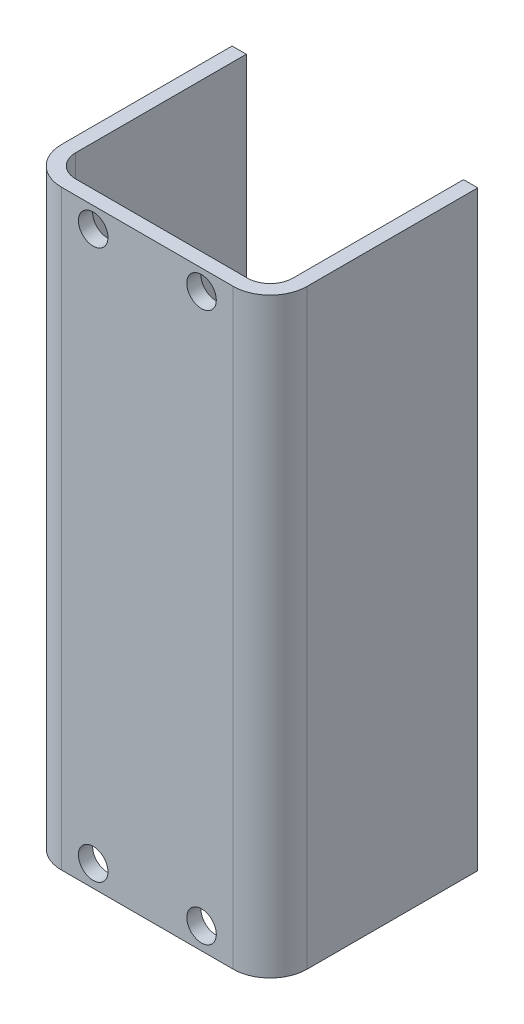
ISO-10303-21;
HEADER;
FILE_DESCRIPTION(('STEP AP214'),'2;1');
FILE_NAME('part.step','',(''),(''),'','','');
FILE_SCHEMA(('AUTOMOTIVE_DESIGN { 1 0 10303 214 1 1 1 1 }'));
ENDSEC;
DATA;
#1=APPLICATION_CONTEXT('core data for automotive mechanical design processes');
#2=APPLICATION_PROTOCOL_DEFINITION('international standard','automotive_design',2000,#1);
#3=PRODUCT_CONTEXT('',#1,'mechanical');
#4=PRODUCT('Part','Part','',(#3));
#5=PRODUCT_RELATED_PRODUCT_CATEGORY('part','',(#4));
#6=PRODUCT_DEFINITION_FORMATION('','',#4);
#7=PRODUCT_DEFINITION_CONTEXT('part definition',#1,'design');
#8=PRODUCT_DEFINITION('design','',#6,#7);
#9=PRODUCT_DEFINITION_SHAPE('','',#8);
#10=(LENGTH_UNIT() NAMED_UNIT(*) SI_UNIT(.MILLI.,.METRE.));
#11=(NAMED_UNIT(*) PLANE_ANGLE_UNIT() SI_UNIT($,.RADIAN.));
#12=(NAMED_UNIT(*) SI_UNIT($,.STERADIAN.) SOLID_ANGLE_UNIT());
#13=UNCERTAINTY_MEASURE_WITH_UNIT(LENGTH_MEASURE(1.E-05),#10,'distance_accuracy_value','');
#14=(GEOMETRIC_REPRESENTATION_CONTEXT(3) GLOBAL_UNCERTAINTY_ASSIGNED_CONTEXT((#13)) GLOBAL_UNIT_ASSIGNED_CONTEXT((#10,
#11,#12)) REPRESENTATION_CONTEXT('',''));
#15=CARTESIAN_POINT('',(0.,0.,0.));
#16=DIRECTION('',(0.,0.,1.));
#17=DIRECTION('',(1.,0.,0.));
#18=AXIS2_PLACEMENT_3D('',#15,#16,#17);
#19=CARTESIAN_POINT('',(4.,104.,-4.));
#20=DIRECTION('',(0.,-1.,0.));
#21=DIRECTION('',(0.,0.,-1.));
#22=AXIS2_PLACEMENT_3D('',#19,#20,#21);
#23=CYLINDRICAL_SURFACE('',#22,4.);
#24=DIRECTION('',(0.,-1.,0.));
#25=VECTOR('',#24,1.);
#26=CARTESIAN_POINT('',(0.,104.,-4.00000000000003));
#27=LINE('',#26,#25);
#28=CARTESIAN_POINT('',(0.,49.5953124657902,-4.00000000000003));
#29=VERTEX_POINT('',#28);
#30=CARTESIAN_POINT('',(0.,0.,-4.00000000000003));
#31=VERTEX_POINT('',#30);
#32=EDGE_CURVE('E331',#29,#31,#27,.T.);
#33=ORIENTED_EDGE('',*,*,#32,.F.);
#34=CARTESIAN_POINT('',(4.,49.5953124657902,-4.));
#35=DIRECTION('',(0.,1.,0.));
#36=DIRECTION('',(0.,0.,1.));
#37=AXIS2_PLACEMENT_3D('',#34,#35,#36);
#38=CIRCLE('',#37,4.);
#39=CARTESIAN_POINT('',(4.00000000000003,49.5953124657902,0.));
#40=VERTEX_POINT('',#39);
#41=EDGE_CURVE('E345',#29,#40,#38,.T.);
#42=ORIENTED_EDGE('',*,*,#41,.T.);
#43=DIRECTION('',(0.,-1.,0.));
#44=VECTOR('',#43,1.);
#45=CARTESIAN_POINT('',(4.00000000000003,104.,0.));
#46=LINE('',#45,#44);
#47=CARTESIAN_POINT('',(4.00000000000003,0.,0.));
#48=VERTEX_POINT('',#47);
#49=EDGE_CURVE('E335',#40,#48,#46,.T.);
#50=ORIENTED_EDGE('',*,*,#49,.T.);
#51=CARTESIAN_POINT('',(4.,0.,-4.));
#52=DIRECTION('',(0.,-1.,0.));
#53=DIRECTION('',(0.,0.,-1.));
#54=AXIS2_PLACEMENT_3D('',#51,#52,#53);
#55=CIRCLE('',#54,4.);
#56=EDGE_CURVE('E283',#48,#31,#55,.T.);
#57=ORIENTED_EDGE('',*,*,#56,.T.);
#58=EDGE_LOOP('',(#33,#42,#50,#57));
#59=FACE_BOUND('',#58,.T.);
#60=ADVANCED_FACE('F41',(#59),#23,.F.);
#61=CARTESIAN_POINT('',(34.2,104.,-4.));
#62=DIRECTION('',(0.,-1.,0.));
#63=DIRECTION('',(0.,0.,-1.));
#64=AXIS2_PLACEMENT_3D('',#61,#62,#63);
#65=CYLINDRICAL_SURFACE('',#64,4.);
#66=DIRECTION('',(0.,-1.,0.));
#67=VECTOR('',#66,1.);
#68=CARTESIAN_POINT('',(38.2,104.,-4.00000000000003));
#69=LINE('',#68,#67);
#70=CARTESIAN_POINT('',(38.2,104.,-4.00000000000003));
#71=VERTEX_POINT('',#70);
#72=CARTESIAN_POINT('',(38.2,55.5953124657902,-4.00000000000003));
#73=VERTEX_POINT('',#72);
#74=EDGE_CURVE('E304',#71,#73,#69,.T.);
#75=ORIENTED_EDGE('',*,*,#74,.T.);
#76=CARTESIAN_POINT('',(34.2,55.5953124657902,-4.));
#77=DIRECTION('',(0.,-1.,0.));
#78=DIRECTION('',(0.,0.,-1.));
#79=AXIS2_PLACEMENT_3D('',#76,#77,#78);
#80=CIRCLE('',#79,4.);
#81=CARTESIAN_POINT('',(34.2,55.5953124657902,0.));
#82=VERTEX_POINT('',#81);
#83=EDGE_CURVE('E342',#73,#82,#80,.T.);
#84=ORIENTED_EDGE('',*,*,#83,.T.);
#85=DIRECTION('',(0.,-1.,0.));
#86=VECTOR('',#85,1.);
#87=CARTESIAN_POINT('',(34.2,104.,0.));
#88=LINE('',#87,#86);
#89=CARTESIAN_POINT('',(34.2,104.,0.));
#90=VERTEX_POINT('',#89);
#91=EDGE_CURVE('E339',#90,#82,#88,.T.);
#92=ORIENTED_EDGE('',*,*,#91,.F.);
#93=CARTESIAN_POINT('',(34.2,104.,-4.));
#94=DIRECTION('',(0.,-1.,0.));
#95=DIRECTION('',(0.,0.,1.));
#96=AXIS2_PLACEMENT_3D('',#93,#94,#95);
#97=CIRCLE('',#96,4.);
#98=EDGE_CURVE('E251',#71,#90,#97,.T.);
#99=ORIENTED_EDGE('',*,*,#98,.F.);
#100=EDGE_LOOP('',(#75,#84,#92,#99));
#101=FACE_BOUND('',#100,.T.);
#102=ADVANCED_FACE('F407',(#101),#65,.F.);
#103=CARTESIAN_POINT('',(4.00000000000003,104.,0.));
#104=DIRECTION('',(0.,0.,1.));
#105=DIRECTION('',(1.,0.,0.));
#106=AXIS2_PLACEMENT_3D('',#103,#104,#105);
#107=PLANE('',#106);
#108=CARTESIAN_POINT('',(9.575,3.81000000000002,0.));
#109=DIRECTION('',(0.,0.,1.));
#110=DIRECTION('',(1.,0.,0.));
#111=AXIS2_PLACEMENT_3D('',#108,#109,#110);
#112=CIRCLE('',#111,2.60000000000001);
#113=CARTESIAN_POINT('',(12.175,3.81000000000002,0.));
#114=VERTEX_POINT('',#113);
#115=EDGE_CURVE('E238',#114,#114,#112,.T.);
#116=ORIENTED_EDGE('',*,*,#115,.T.);
#117=EDGE_LOOP('',(#116));
#118=FACE_BOUND('',#117,.T.);
#119=CARTESIAN_POINT('',(28.625,3.81000000000009,0.));
#120=DIRECTION('',(0.,0.,1.));
#121=DIRECTION('',(1.,0.,0.));
#122=AXIS2_PLACEMENT_3D('',#119,#120,#121);
#123=CIRCLE('',#122,2.59999999999999);
#124=CARTESIAN_POINT('',(31.225,3.81000000000009,0.));
#125=VERTEX_POINT('',#124);
#126=EDGE_CURVE('E247',#125,#125,#123,.T.);
#127=ORIENTED_EDGE('',*,*,#126,.T.);
#128=EDGE_LOOP('',(#127));
#129=FACE_BOUND('',#128,.T.);
#130=DIRECTION('',(-1.,0.,0.));
#131=VECTOR('',#130,1.);
#132=CARTESIAN_POINT('',(34.2,49.5953124657902,0.));
#133=LINE('',#132,#131);
#134=CARTESIAN_POINT('',(34.2,49.5953124657902,0.));
#135=VERTEX_POINT('',#134);
#136=EDGE_CURVE('E220',#135,#40,#133,.T.);
#137=ORIENTED_EDGE('',*,*,#136,.F.);
#138=CARTESIAN_POINT('',(34.2,0.,0.));
#139=VERTEX_POINT('',#138);
#140=EDGE_CURVE('E338',#135,#139,#88,.T.);
#141=ORIENTED_EDGE('',*,*,#140,.T.);
#142=DIRECTION('',(-1.,0.,0.));
#143=VECTOR('',#142,1.);
#144=CARTESIAN_POINT('',(4.00000000000003,0.,0.));
#145=LINE('',#144,#143);
#146=EDGE_CURVE('E280',#139,#48,#145,.T.);
#147=ORIENTED_EDGE('',*,*,#146,.T.);
#148=ORIENTED_EDGE('',*,*,#49,.F.);
#149=EDGE_LOOP('',(#137,#141,#147,#148));
#150=FACE_BOUND('',#149,.T.);
#151=ADVANCED_FACE('F409',(#118,#129,#150),#107,.F.);
#152=CARTESIAN_POINT('',(28.6249999999997,100.41,0.));
#153=DIRECTION('',(0.,0.,1.));
#154=DIRECTION('',(1.,0.,0.));
#155=AXIS2_PLACEMENT_3D('',#152,#153,#154);
#156=CIRCLE('',#155,2.6);
#157=CARTESIAN_POINT('',(31.2249999999997,100.41,0.));
#158=VERTEX_POINT('',#157);
#159=EDGE_CURVE('E241',#158,#158,#156,.T.);
#160=ORIENTED_EDGE('',*,*,#159,.T.);
#161=EDGE_LOOP('',(#160));
#162=FACE_BOUND('',#161,.T.);
#163=CARTESIAN_POINT('',(9.57499999999966,100.41,0.));
#164=DIRECTION('',(0.,0.,1.));
#165=DIRECTION('',(1.,0.,0.));
#166=AXIS2_PLACEMENT_3D('',#163,#164,#165);
#167=CIRCLE('',#166,2.6);
#168=CARTESIAN_POINT('',(12.1749999999997,100.41,0.));
#169=VERTEX_POINT('',#168);
#170=EDGE_CURVE('E244',#169,#169,#167,.T.);
#171=ORIENTED_EDGE('',*,*,#170,.T.);
#172=EDGE_LOOP('',(#171));
#173=FACE_BOUND('',#172,.T.);
#174=DIRECTION('',(1.,0.,0.));
#175=VECTOR('',#174,1.);
#176=CARTESIAN_POINT('',(34.2,55.5953124657902,0.));
#177=LINE('',#176,#175);
#178=CARTESIAN_POINT('',(4.00000000000003,55.5953124657902,0.));
#179=VERTEX_POINT('',#178);
#180=EDGE_CURVE('E217',#179,#82,#177,.T.);
#181=ORIENTED_EDGE('',*,*,#180,.F.);
#182=CARTESIAN_POINT('',(4.00000000000003,104.,0.));
#183=VERTEX_POINT('',#182);
#184=EDGE_CURVE('E336',#183,#179,#46,.T.);
#185=ORIENTED_EDGE('',*,*,#184,.F.);
#186=DIRECTION('',(-1.,0.,0.));
#187=VECTOR('',#186,1.);
#188=CARTESIAN_POINT('',(4.00000000000003,104.,0.));
#189=LINE('',#188,#187);
#190=EDGE_CURVE('E254',#90,#183,#189,.T.);
#191=ORIENTED_EDGE('',*,*,#190,.F.);
#192=ORIENTED_EDGE('',*,*,#91,.T.);
#193=EDGE_LOOP('',(#181,#185,#191,#192));
#194=FACE_BOUND('',#193,.T.);
#195=ADVANCED_FACE('F399',(#162,#173,#194),#107,.F.);
#196=CARTESIAN_POINT('',(34.2,49.5953124657902,-4.));
#197=DIRECTION('',(0.,1.,0.));
#198=DIRECTION('',(0.,0.,1.));
#199=AXIS2_PLACEMENT_3D('',#196,#197,#198);
#200=CIRCLE('',#199,4.);
#201=CARTESIAN_POINT('',(38.2,49.5953124657902,-4.00000000000003));
#202=VERTEX_POINT('',#201);
#203=EDGE_CURVE('E64',#135,#202,#200,.T.);
#204=ORIENTED_EDGE('',*,*,#203,.T.);
#205=CARTESIAN_POINT('',(38.2,0.,-4.00000000000003));
#206=VERTEX_POINT('',#205);
#207=EDGE_CURVE('E277',#202,#206,#69,.T.);
#208=ORIENTED_EDGE('',*,*,#207,.T.);
#209=CARTESIAN_POINT('',(34.2,0.,-4.));
#210=DIRECTION('',(0.,-1.,0.));
#211=DIRECTION('',(0.,0.,1.));
#212=AXIS2_PLACEMENT_3D('',#209,#210,#211);
#213=CIRCLE('',#212,4.);
#214=EDGE_CURVE('E250',#206,#139,#213,.T.);
#215=ORIENTED_EDGE('',*,*,#214,.T.);
#216=ORIENTED_EDGE('',*,*,#140,.F.);
#217=EDGE_LOOP('',(#204,#208,#215,#216));
#218=FACE_BOUND('',#217,.T.);
#219=ADVANCED_FACE('F411',(#218),#65,.F.);
#220=CARTESIAN_POINT('',(4.,55.5953124657902,-4.));
#221=DIRECTION('',(0.,-1.,0.));
#222=DIRECTION('',(0.,0.,-1.));
#223=AXIS2_PLACEMENT_3D('',#220,#221,#222);
#224=CIRCLE('',#223,4.);
#225=CARTESIAN_POINT('',(0.,55.5953124657902,-4.00000000000003));
#226=VERTEX_POINT('',#225);
#227=EDGE_CURVE('E56',#179,#226,#224,.T.);
#228=ORIENTED_EDGE('',*,*,#227,.T.);
#229=CARTESIAN_POINT('',(0.,104.,-4.00000000000003));
#230=VERTEX_POINT('',#229);
#231=EDGE_CURVE('E332',#230,#226,#27,.T.);
#232=ORIENTED_EDGE('',*,*,#231,.F.);
#233=CARTESIAN_POINT('',(4.,104.,-4.));
#234=DIRECTION('',(0.,-1.,0.));
#235=DIRECTION('',(0.,0.,-1.));
#236=AXIS2_PLACEMENT_3D('',#233,#234,#235);
#237=CIRCLE('',#236,4.);
#238=EDGE_CURVE('E257',#183,#230,#237,.T.);
#239=ORIENTED_EDGE('',*,*,#238,.F.);
#240=ORIENTED_EDGE('',*,*,#184,.T.);
#241=EDGE_LOOP('',(#228,#232,#239,#240));
#242=FACE_BOUND('',#241,.T.);
#243=ADVANCED_FACE('F391',(#242),#23,.F.);
#244=CARTESIAN_POINT('',(0.,104.,-4.00000000000003));
#245=DIRECTION('',(-1.,0.,0.));
#246=DIRECTION('',(0.,0.,1.));
#247=AXIS2_PLACEMENT_3D('',#244,#245,#246);
#248=PLANE('',#247);
#249=DIRECTION('',(0.,1.,0.));
#250=VECTOR('',#249,1.);
#251=CARTESIAN_POINT('',(0.,104.,-4.85941170815556));
#252=LINE('',#251,#250);
#253=CARTESIAN_POINT('',(0.,55.5953124657902,-4.85941170815556));
#254=VERTEX_POINT('',#253);
#255=CARTESIAN_POINT('',(0.,49.5953124657902,-4.85941170815556));
#256=VERTEX_POINT('',#255);
#257=EDGE_CURVE('E366',#254,#256,#252,.F.);
#258=ORIENTED_EDGE('',*,*,#257,.T.);
#259=DIRECTION('',(0.,0.,1.));
#260=VECTOR('',#259,1.);
#261=CARTESIAN_POINT('',(0.,49.5953124657902,-2.));
#262=LINE('',#261,#260);
#263=EDGE_CURVE('E369',#256,#29,#262,.T.);
#264=ORIENTED_EDGE('',*,*,#263,.T.);
#265=ORIENTED_EDGE('',*,*,#32,.T.);
#266=DIRECTION('',(0.,0.,-1.));
#267=VECTOR('',#266,1.);
#268=CARTESIAN_POINT('',(0.,0.,-4.00000000000003));
#269=LINE('',#268,#267);
#270=CARTESIAN_POINT('',(0.,0.,-34.));
#271=VERTEX_POINT('',#270);
#272=EDGE_CURVE('E286',#31,#271,#269,.T.);
#273=ORIENTED_EDGE('',*,*,#272,.T.);
#274=DIRECTION('',(0.,-1.,0.));
#275=VECTOR('',#274,1.);
#276=CARTESIAN_POINT('',(0.,104.,-34.));
#277=LINE('',#276,#275);
#278=CARTESIAN_POINT('',(0.,104.,-34.));
#279=VERTEX_POINT('',#278);
#280=EDGE_CURVE('E328',#279,#271,#277,.T.);
#281=ORIENTED_EDGE('',*,*,#280,.F.);
#282=DIRECTION('',(0.,0.,-1.));
#283=VECTOR('',#282,1.);
#284=CARTESIAN_POINT('',(0.,104.,-4.00000000000003));
#285=LINE('',#284,#283);
#286=EDGE_CURVE('E259',#230,#279,#285,.T.);
#287=ORIENTED_EDGE('',*,*,#286,.F.);
#288=ORIENTED_EDGE('',*,*,#231,.T.);
#289=DIRECTION('',(0.,0.,-1.));
#290=VECTOR('',#289,1.);
#291=CARTESIAN_POINT('',(0.,55.5953124657902,-2.));
#292=LINE('',#291,#290);
#293=EDGE_CURVE('E363',#226,#254,#292,.T.);
#294=ORIENTED_EDGE('',*,*,#293,.T.);
#295=EDGE_LOOP('',(#258,#264,#265,#273,#281,#287,#288,#294));
#296=FACE_BOUND('',#295,.T.);
#297=ADVANCED_FACE('F387',(#296),#248,.F.);
#298=CARTESIAN_POINT('',(-2.5,104.,-34.));
#299=DIRECTION('',(0.,0.,1.));
#300=DIRECTION('',(1.,0.,0.));
#301=AXIS2_PLACEMENT_3D('',#298,#299,#300);
#302=PLANE('',#301);
#303=DIRECTION('',(-1.,0.,0.));
#304=VECTOR('',#303,1.);
#305=CARTESIAN_POINT('',(-2.5,0.,-34.));
#306=LINE('',#305,#304);
#307=CARTESIAN_POINT('',(-2.5,0.,-34.));
#308=VERTEX_POINT('',#307);
#309=EDGE_CURVE('E288',#271,#308,#306,.T.);
#310=ORIENTED_EDGE('',*,*,#309,.T.);
#311=DIRECTION('',(0.,-1.,0.));
#312=VECTOR('',#311,1.);
#313=CARTESIAN_POINT('',(-2.5,104.,-34.));
#314=LINE('',#313,#312);
#315=CARTESIAN_POINT('',(-2.5,104.,-34.));
#316=VERTEX_POINT('',#315);
#317=EDGE_CURVE('E325',#316,#308,#314,.T.);
#318=ORIENTED_EDGE('',*,*,#317,.F.);
#319=DIRECTION('',(-1.,0.,0.));
#320=VECTOR('',#319,1.);
#321=CARTESIAN_POINT('',(-2.5,104.,-34.));
#322=LINE('',#321,#320);
#323=EDGE_CURVE('E261',#279,#316,#322,.T.);
#324=ORIENTED_EDGE('',*,*,#323,.F.);
#325=ORIENTED_EDGE('',*,*,#280,.T.);
#326=EDGE_LOOP('',(#310,#318,#324,#325));
#327=FACE_BOUND('',#326,.T.);
#328=ADVANCED_FACE('F434',(#327),#302,.F.);
#329=CARTESIAN_POINT('',(-2.5,104.,-4.00000000000003));
#330=DIRECTION('',(1.,0.,0.));
#331=DIRECTION('',(0.,0.,-1.));
#332=AXIS2_PLACEMENT_3D('',#329,#330,#331);
#333=PLANE('',#332);
#334=DIRECTION('',(0.,0.,1.));
#335=VECTOR('',#334,1.);
#336=CARTESIAN_POINT('',(-2.5,0.,-4.00000000000003));
#337=LINE('',#336,#335);
#338=CARTESIAN_POINT('',(-2.5,0.,-4.00000000000003));
#339=VERTEX_POINT('',#338);
#340=EDGE_CURVE('E290',#308,#339,#337,.T.);
#341=ORIENTED_EDGE('',*,*,#340,.T.);
#342=DIRECTION('',(0.,-1.,0.));
#343=VECTOR('',#342,1.);
#344=CARTESIAN_POINT('',(-2.5,104.,-4.00000000000003));
#345=LINE('',#344,#343);
#346=CARTESIAN_POINT('',(-2.5,104.,-4.00000000000003));
#347=VERTEX_POINT('',#346);
#348=EDGE_CURVE('E322',#347,#339,#345,.T.);
#349=ORIENTED_EDGE('',*,*,#348,.F.);
#350=DIRECTION('',(0.,0.,1.));
#351=VECTOR('',#350,1.);
#352=CARTESIAN_POINT('',(-2.5,104.,-4.00000000000003));
#353=LINE('',#352,#351);
#354=EDGE_CURVE('E263',#316,#347,#353,.T.);
#355=ORIENTED_EDGE('',*,*,#354,.F.);
#356=ORIENTED_EDGE('',*,*,#317,.T.);
#357=EDGE_LOOP('',(#341,#349,#355,#356));
#358=FACE_BOUND('',#357,.T.);
#359=ADVANCED_FACE('F437',(#358),#333,.F.);
#360=CARTESIAN_POINT('',(4.,104.,-4.));
#361=DIRECTION('',(0.,-1.,0.));
#362=DIRECTION('',(0.,0.,-1.));
#363=AXIS2_PLACEMENT_3D('',#360,#361,#362);
#364=CYLINDRICAL_SURFACE('',#363,6.5);
#365=CARTESIAN_POINT('',(4.,0.,-4.));
#366=DIRECTION('',(0.,1.,0.));
#367=DIRECTION('',(0.,0.,-1.));
#368=AXIS2_PLACEMENT_3D('',#365,#366,#367);
#369=CIRCLE('',#368,6.5);
#370=CARTESIAN_POINT('',(4.00000000000004,0.,2.5));
#371=VERTEX_POINT('',#370);
#372=EDGE_CURVE('E292',#339,#371,#369,.T.);
#373=ORIENTED_EDGE('',*,*,#372,.T.);
#374=DIRECTION('',(0.,-1.,0.));
#375=VECTOR('',#374,1.);
#376=CARTESIAN_POINT('',(4.00000000000004,104.,2.5));
#377=LINE('',#376,#375);
#378=CARTESIAN_POINT('',(4.00000000000004,104.,2.5));
#379=VERTEX_POINT('',#378);
#380=EDGE_CURVE('E319',#379,#371,#377,.T.);
#381=ORIENTED_EDGE('',*,*,#380,.F.);
#382=CARTESIAN_POINT('',(4.,104.,-4.));
#383=DIRECTION('',(0.,1.,0.));
#384=DIRECTION('',(0.,0.,-1.));
#385=AXIS2_PLACEMENT_3D('',#382,#383,#384);
#386=CIRCLE('',#385,6.5);
#387=EDGE_CURVE('E265',#347,#379,#386,.T.);
#388=ORIENTED_EDGE('',*,*,#387,.F.);
#389=ORIENTED_EDGE('',*,*,#348,.T.);
#390=EDGE_LOOP('',(#373,#381,#388,#389));
#391=FACE_BOUND('',#390,.T.);
#392=ADVANCED_FACE('F441',(#391),#364,.T.);
#393=CARTESIAN_POINT('',(4.00000000000004,104.,2.5));
#394=DIRECTION('',(0.,0.,-1.));
#395=DIRECTION('',(-1.,0.,0.));
#396=AXIS2_PLACEMENT_3D('',#393,#394,#395);
#397=PLANE('',#396);
#398=CARTESIAN_POINT('',(28.625,3.81000000000009,2.5));
#399=DIRECTION('',(0.,0.,1.));
#400=DIRECTION('',(1.,0.,0.));
#401=AXIS2_PLACEMENT_3D('',#398,#399,#400);
#402=CIRCLE('',#401,2.59999999999999);
#403=CARTESIAN_POINT('',(31.225,3.81000000000009,2.5));
#404=VERTEX_POINT('',#403);
#405=EDGE_CURVE('E230',#404,#404,#402,.T.);
#406=ORIENTED_EDGE('',*,*,#405,.F.);
#407=EDGE_LOOP('',(#406));
#408=FACE_BOUND('',#407,.T.);
#409=CARTESIAN_POINT('',(9.57499999999966,100.41,2.5));
#410=DIRECTION('',(0.,0.,1.));
#411=DIRECTION('',(1.,0.,0.));
#412=AXIS2_PLACEMENT_3D('',#409,#410,#411);
#413=CIRCLE('',#412,2.6);
#414=CARTESIAN_POINT('',(12.1749999999997,100.41,2.5));
#415=VERTEX_POINT('',#414);
#416=EDGE_CURVE('E229',#415,#415,#413,.T.);
#417=ORIENTED_EDGE('',*,*,#416,.F.);
#418=EDGE_LOOP('',(#417));
#419=FACE_BOUND('',#418,.T.);
#420=CARTESIAN_POINT('',(28.6249999999997,100.41,2.5));
#421=DIRECTION('',(0.,0.,1.));
#422=DIRECTION('',(1.,0.,0.));
#423=AXIS2_PLACEMENT_3D('',#420,#421,#422);
#424=CIRCLE('',#423,2.6);
#425=CARTESIAN_POINT('',(31.2249999999997,100.41,2.5));
#426=VERTEX_POINT('',#425);
#427=EDGE_CURVE('E225',#426,#426,#424,.T.);
#428=ORIENTED_EDGE('',*,*,#427,.F.);
#429=EDGE_LOOP('',(#428));
#430=FACE_BOUND('',#429,.T.);
#431=CARTESIAN_POINT('',(9.575,3.81000000000002,2.5));
#432=DIRECTION('',(0.,0.,1.));
#433=DIRECTION('',(1.,0.,0.));
#434=AXIS2_PLACEMENT_3D('',#431,#432,#433);
#435=CIRCLE('',#434,2.60000000000001);
#436=CARTESIAN_POINT('',(12.175,3.81000000000002,2.5));
#437=VERTEX_POINT('',#436);
#438=EDGE_CURVE('E233',#437,#437,#435,.T.);
#439=ORIENTED_EDGE('',*,*,#438,.F.);
#440=EDGE_LOOP('',(#439));
#441=FACE_BOUND('',#440,.T.);
#442=DIRECTION('',(1.,0.,0.));
#443=VECTOR('',#442,1.);
#444=CARTESIAN_POINT('',(4.00000000000004,0.,2.5));
#445=LINE('',#444,#443);
#446=CARTESIAN_POINT('',(34.2,0.,2.5));
#447=VERTEX_POINT('',#446);
#448=EDGE_CURVE('E294',#371,#447,#445,.T.);
#449=ORIENTED_EDGE('',*,*,#448,.T.);
#450=DIRECTION('',(0.,-1.,0.));
#451=VECTOR('',#450,1.);
#452=CARTESIAN_POINT('',(34.2,104.,2.5));
#453=LINE('',#452,#451);
#454=CARTESIAN_POINT('',(34.2,104.,2.5));
#455=VERTEX_POINT('',#454);
#456=EDGE_CURVE('E316',#455,#447,#453,.T.);
#457=ORIENTED_EDGE('',*,*,#456,.F.);
#458=DIRECTION('',(1.,0.,0.));
#459=VECTOR('',#458,1.);
#460=CARTESIAN_POINT('',(4.00000000000004,104.,2.5));
#461=LINE('',#460,#459);
#462=EDGE_CURVE('E267',#379,#455,#461,.T.);
#463=ORIENTED_EDGE('',*,*,#462,.F.);
#464=ORIENTED_EDGE('',*,*,#380,.T.);
#465=EDGE_LOOP('',(#449,#457,#463,#464));
#466=FACE_BOUND('',#465,.T.);
#467=ADVANCED_FACE('F445',(#408,#419,#430,#441,#466),#397,.F.);
#468=CARTESIAN_POINT('',(34.2,104.,-4.));
#469=DIRECTION('',(0.,-1.,0.));
#470=DIRECTION('',(0.,0.,-1.));
#471=AXIS2_PLACEMENT_3D('',#468,#469,#470);
#472=CYLINDRICAL_SURFACE('',#471,6.5);
#473=CARTESIAN_POINT('',(34.2,0.,-4.));
#474=DIRECTION('',(0.,1.,0.));
#475=DIRECTION('',(0.,0.,1.));
#476=AXIS2_PLACEMENT_3D('',#473,#474,#475);
#477=CIRCLE('',#476,6.5);
#478=CARTESIAN_POINT('',(40.7,0.,-4.00000000000005));
#479=VERTEX_POINT('',#478);
#480=EDGE_CURVE('E296',#447,#479,#477,.T.);
#481=ORIENTED_EDGE('',*,*,#480,.T.);
#482=DIRECTION('',(0.,-1.,0.));
#483=VECTOR('',#482,1.);
#484=CARTESIAN_POINT('',(40.7,104.,-4.00000000000005));
#485=LINE('',#484,#483);
#486=CARTESIAN_POINT('',(40.7,104.,-4.00000000000005));
#487=VERTEX_POINT('',#486);
#488=EDGE_CURVE('E313',#487,#479,#485,.T.);
#489=ORIENTED_EDGE('',*,*,#488,.F.);
#490=CARTESIAN_POINT('',(34.2,104.,-4.));
#491=DIRECTION('',(0.,1.,0.));
#492=DIRECTION('',(0.,0.,1.));
#493=AXIS2_PLACEMENT_3D('',#490,#491,#492);
#494=CIRCLE('',#493,6.5);
#495=EDGE_CURVE('E269',#455,#487,#494,.T.);
#496=ORIENTED_EDGE('',*,*,#495,.F.);
#497=ORIENTED_EDGE('',*,*,#456,.T.);
#498=EDGE_LOOP('',(#481,#489,#496,#497));
#499=FACE_BOUND('',#498,.T.);
#500=ADVANCED_FACE('F449',(#499),#472,.T.);
#501=CARTESIAN_POINT('',(40.7,104.,-4.00000000000004));
#502=DIRECTION('',(-1.,0.,0.));
#503=DIRECTION('',(0.,0.,1.));
#504=AXIS2_PLACEMENT_3D('',#501,#502,#503);
#505=PLANE('',#504);
#506=DIRECTION('',(0.,0.,-1.));
#507=VECTOR('',#506,1.);
#508=CARTESIAN_POINT('',(40.7,0.,-4.00000000000004));
#509=LINE('',#508,#507);
#510=CARTESIAN_POINT('',(40.7,0.,-34.));
#511=VERTEX_POINT('',#510);
#512=EDGE_CURVE('E298',#479,#511,#509,.T.);
#513=ORIENTED_EDGE('',*,*,#512,.T.);
#514=DIRECTION('',(0.,-1.,0.));
#515=VECTOR('',#514,1.);
#516=CARTESIAN_POINT('',(40.7,104.,-34.));
#517=LINE('',#516,#515);
#518=CARTESIAN_POINT('',(40.7,104.,-34.));
#519=VERTEX_POINT('',#518);
#520=EDGE_CURVE('E310',#519,#511,#517,.T.);
#521=ORIENTED_EDGE('',*,*,#520,.F.);
#522=DIRECTION('',(0.,0.,-1.));
#523=VECTOR('',#522,1.);
#524=CARTESIAN_POINT('',(40.7,104.,-4.00000000000004));
#525=LINE('',#524,#523);
#526=EDGE_CURVE('E271',#487,#519,#525,.T.);
#527=ORIENTED_EDGE('',*,*,#526,.F.);
#528=ORIENTED_EDGE('',*,*,#488,.T.);
#529=EDGE_LOOP('',(#513,#521,#527,#528));
#530=FACE_BOUND('',#529,.T.);
#531=ADVANCED_FACE('F453',(#530),#505,.F.);
#532=CARTESIAN_POINT('',(38.2,104.,-34.));
#533=DIRECTION('',(0.,0.,1.));
#534=DIRECTION('',(1.,0.,0.));
#535=AXIS2_PLACEMENT_3D('',#532,#533,#534);
#536=PLANE('',#535);
#537=DIRECTION('',(-1.,0.,0.));
#538=VECTOR('',#537,1.);
#539=CARTESIAN_POINT('',(38.2,0.,-34.));
#540=LINE('',#539,#538);
#541=CARTESIAN_POINT('',(38.2,0.,-34.));
#542=VERTEX_POINT('',#541);
#543=EDGE_CURVE('E300',#511,#542,#540,.T.);
#544=ORIENTED_EDGE('',*,*,#543,.T.);
#545=DIRECTION('',(0.,-1.,0.));
#546=VECTOR('',#545,1.);
#547=CARTESIAN_POINT('',(38.2,104.,-34.));
#548=LINE('',#547,#546);
#549=CARTESIAN_POINT('',(38.2,104.,-34.));
#550=VERTEX_POINT('',#549);
#551=EDGE_CURVE('E307',#550,#542,#548,.T.);
#552=ORIENTED_EDGE('',*,*,#551,.F.);
#553=DIRECTION('',(-1.,0.,0.));
#554=VECTOR('',#553,1.);
#555=CARTESIAN_POINT('',(38.2,104.,-34.));
#556=LINE('',#555,#554);
#557=EDGE_CURVE('E273',#519,#550,#556,.T.);
#558=ORIENTED_EDGE('',*,*,#557,.F.);
#559=ORIENTED_EDGE('',*,*,#520,.T.);
#560=EDGE_LOOP('',(#544,#552,#558,#559));
#561=FACE_BOUND('',#560,.T.);
#562=ADVANCED_FACE('F457',(#561),#536,.F.);
#563=CARTESIAN_POINT('',(38.2,104.,-4.00000000000003));
#564=DIRECTION('',(1.,0.,0.));
#565=DIRECTION('',(0.,0.,-1.));
#566=AXIS2_PLACEMENT_3D('',#563,#564,#565);
#567=PLANE('',#566);
#568=DIRECTION('',(0.,1.,0.));
#569=VECTOR('',#568,1.);
#570=CARTESIAN_POINT('',(38.2,104.,-4.85941170815552));
#571=LINE('',#570,#569);
#572=CARTESIAN_POINT('',(38.2,49.5953124657902,-4.85941170815552));
#573=VERTEX_POINT('',#572);
#574=CARTESIAN_POINT('',(38.2,55.5953124657902,-4.85941170815552));
#575=VERTEX_POINT('',#574);
#576=EDGE_CURVE('E356',#573,#575,#571,.T.);
#577=ORIENTED_EDGE('',*,*,#576,.T.);
#578=DIRECTION('',(0.,0.,1.));
#579=VECTOR('',#578,1.);
#580=CARTESIAN_POINT('',(38.2,55.5953124657902,-2.));
#581=LINE('',#580,#579);
#582=EDGE_CURVE('E359',#575,#73,#581,.T.);
#583=ORIENTED_EDGE('',*,*,#582,.T.);
#584=ORIENTED_EDGE('',*,*,#74,.F.);
#585=DIRECTION('',(0.,0.,1.));
#586=VECTOR('',#585,1.);
#587=CARTESIAN_POINT('',(38.2,104.,-4.00000000000003));
#588=LINE('',#587,#586);
#589=EDGE_CURVE('E275',#550,#71,#588,.T.);
#590=ORIENTED_EDGE('',*,*,#589,.F.);
#591=ORIENTED_EDGE('',*,*,#551,.T.);
#592=DIRECTION('',(0.,0.,1.));
#593=VECTOR('',#592,1.);
#594=CARTESIAN_POINT('',(38.2,0.,-4.00000000000003));
#595=LINE('',#594,#593);
#596=EDGE_CURVE('E255',#542,#206,#595,.T.);
#597=ORIENTED_EDGE('',*,*,#596,.T.);
#598=ORIENTED_EDGE('',*,*,#207,.F.);
#599=DIRECTION('',(0.,0.,-1.));
#600=VECTOR('',#599,1.);
#601=CARTESIAN_POINT('',(38.2,49.5953124657902,-2.));
#602=LINE('',#601,#600);
#603=EDGE_CURVE('E353',#202,#573,#602,.T.);
#604=ORIENTED_EDGE('',*,*,#603,.T.);
#605=EDGE_LOOP('',(#577,#583,#584,#590,#591,#597,#598,#604));
#606=FACE_BOUND('',#605,.T.);
#607=ADVANCED_FACE('F404',(#606),#567,.F.);
#608=CARTESIAN_POINT('',(34.2,104.,-4.));
#609=DIRECTION('',(0.,1.,0.));
#610=DIRECTION('',(0.,0.,1.));
#611=AXIS2_PLACEMENT_3D('',#608,#609,#610);
#612=PLANE('',#611);
#613=ORIENTED_EDGE('',*,*,#98,.T.);
#614=ORIENTED_EDGE('',*,*,#190,.T.);
#615=ORIENTED_EDGE('',*,*,#238,.T.);
#616=ORIENTED_EDGE('',*,*,#286,.T.);
#617=ORIENTED_EDGE('',*,*,#323,.T.);
#618=ORIENTED_EDGE('',*,*,#354,.T.);
#619=ORIENTED_EDGE('',*,*,#387,.T.);
#620=ORIENTED_EDGE('',*,*,#462,.T.);
#621=ORIENTED_EDGE('',*,*,#495,.T.);
#622=ORIENTED_EDGE('',*,*,#526,.T.);
#623=ORIENTED_EDGE('',*,*,#557,.T.);
#624=ORIENTED_EDGE('',*,*,#589,.T.);
#625=EDGE_LOOP('',(#613,#614,#615,#616,#617,#618,#619,#620,#621,#622,#623,#624));
#626=FACE_BOUND('',#625,.T.);
#627=ADVANCED_FACE('F395',(#626),#612,.T.);
#628=CARTESIAN_POINT('',(34.2,0.,-4.));
#629=DIRECTION('',(0.,1.,0.));
#630=DIRECTION('',(0.,0.,1.));
#631=AXIS2_PLACEMENT_3D('',#628,#629,#630);
#632=PLANE('',#631);
#633=ORIENTED_EDGE('',*,*,#214,.F.);
#634=ORIENTED_EDGE('',*,*,#596,.F.);
#635=ORIENTED_EDGE('',*,*,#543,.F.);
#636=ORIENTED_EDGE('',*,*,#512,.F.);
#637=ORIENTED_EDGE('',*,*,#480,.F.);
#638=ORIENTED_EDGE('',*,*,#448,.F.);
#639=ORIENTED_EDGE('',*,*,#372,.F.);
#640=ORIENTED_EDGE('',*,*,#340,.F.);
#641=ORIENTED_EDGE('',*,*,#309,.F.);
#642=ORIENTED_EDGE('',*,*,#272,.F.);
#643=ORIENTED_EDGE('',*,*,#56,.F.);
#644=ORIENTED_EDGE('',*,*,#146,.F.);
#645=EDGE_LOOP('',(#633,#634,#635,#636,#637,#638,#639,#640,#641,#642,#643,#644));
#646=FACE_BOUND('',#645,.T.);
#647=ADVANCED_FACE('F464',(#646),#632,.F.);
#648=CARTESIAN_POINT('',(9.575,3.81000000000002,-105.5));
#649=DIRECTION('',(0.,0.,1.));
#650=DIRECTION('',(1.,0.,0.));
#651=AXIS2_PLACEMENT_3D('',#648,#649,#650);
#652=CYLINDRICAL_SURFACE('',#651,2.60000000000001);
#653=ORIENTED_EDGE('',*,*,#438,.T.);
#654=EDGE_LOOP('',(#653));
#655=FACE_BOUND('',#654,.T.);
#656=ORIENTED_EDGE('',*,*,#115,.F.);
#657=EDGE_LOOP('',(#656));
#658=FACE_BOUND('',#657,.T.);
#659=ADVANCED_FACE('F467',(#655,#658),#652,.F.);
#660=CARTESIAN_POINT('',(28.6249999999997,100.41,-105.5));
#661=DIRECTION('',(0.,0.,1.));
#662=DIRECTION('',(1.,0.,0.));
#663=AXIS2_PLACEMENT_3D('',#660,#661,#662);
#664=CYLINDRICAL_SURFACE('',#663,2.6);
#665=ORIENTED_EDGE('',*,*,#427,.T.);
#666=EDGE_LOOP('',(#665));
#667=FACE_BOUND('',#666,.T.);
#668=ORIENTED_EDGE('',*,*,#159,.F.);
#669=EDGE_LOOP('',(#668));
#670=FACE_BOUND('',#669,.T.);
#671=ADVANCED_FACE('F473',(#667,#670),#664,.F.);
#672=CARTESIAN_POINT('',(9.57499999999966,100.41,-105.5));
#673=DIRECTION('',(0.,0.,1.));
#674=DIRECTION('',(1.,0.,0.));
#675=AXIS2_PLACEMENT_3D('',#672,#673,#674);
#676=CYLINDRICAL_SURFACE('',#675,2.6);
#677=ORIENTED_EDGE('',*,*,#416,.T.);
#678=EDGE_LOOP('',(#677));
#679=FACE_BOUND('',#678,.T.);
#680=ORIENTED_EDGE('',*,*,#170,.F.);
#681=EDGE_LOOP('',(#680));
#682=FACE_BOUND('',#681,.T.);
#683=ADVANCED_FACE('F475',(#679,#682),#676,.F.);
#684=CARTESIAN_POINT('',(28.625,3.81000000000009,-105.5));
#685=DIRECTION('',(0.,0.,1.));
#686=DIRECTION('',(1.,0.,0.));
#687=AXIS2_PLACEMENT_3D('',#684,#685,#686);
#688=CYLINDRICAL_SURFACE('',#687,2.59999999999999);
#689=ORIENTED_EDGE('',*,*,#405,.T.);
#690=EDGE_LOOP('',(#689));
#691=FACE_BOUND('',#690,.T.);
#692=ORIENTED_EDGE('',*,*,#126,.F.);
#693=EDGE_LOOP('',(#692));
#694=FACE_BOUND('',#693,.T.);
#695=ADVANCED_FACE('F478',(#691,#694),#688,.F.);
#696=CARTESIAN_POINT('',(34.2,49.5953124657902,-2.));
#697=DIRECTION('',(0.,1.,0.));
#698=DIRECTION('',(0.,0.,1.));
#699=AXIS2_PLACEMENT_3D('',#696,#697,#698);
#700=PLANE('',#699);
#701=ORIENTED_EDGE('',*,*,#136,.T.);
#702=ORIENTED_EDGE('',*,*,#41,.F.);
#703=ORIENTED_EDGE('',*,*,#263,.F.);
#704=CARTESIAN_POINT('',(3.,49.5953124657902,-4.85941170815556));
#705=DIRECTION('',(0.,1.,0.));
#706=DIRECTION('',(0.,0.,1.));
#707=AXIS2_PLACEMENT_3D('',#704,#705,#706);
#708=CIRCLE('',#707,3.);
#709=CARTESIAN_POINT('',(3.58834840541449,49.5953124657902,-1.91766968108279));
#710=VERTEX_POINT('',#709);
#711=EDGE_CURVE('E49',#256,#710,#708,.T.);
#712=ORIENTED_EDGE('',*,*,#711,.T.);
#713=DIRECTION('',(-0.980580675690924,0.,0.196116135138164));
#714=VECTOR('',#713,1.);
#715=CARTESIAN_POINT('',(33.0384615384618,49.5953124657902,-7.80769230769162));
#716=LINE('',#715,#714);
#717=CARTESIAN_POINT('',(4.00000000000003,49.5953124657902,-2.));
#718=VERTEX_POINT('',#717);
#719=EDGE_CURVE('E207',#710,#718,#716,.F.);
#720=ORIENTED_EDGE('',*,*,#719,.T.);
#721=DIRECTION('',(-1.,0.,0.));
#722=VECTOR('',#721,1.);
#723=CARTESIAN_POINT('',(34.2,49.5953124657902,-2.));
#724=LINE('',#723,#722);
#725=CARTESIAN_POINT('',(34.2,49.5953124657902,-2.));
#726=VERTEX_POINT('',#725);
#727=EDGE_CURVE('E203',#726,#718,#724,.T.);
#728=ORIENTED_EDGE('',*,*,#727,.F.);
#729=DIRECTION('',(0.980580675690924,0.,0.196116135138167));
#730=VECTOR('',#729,1.);
#731=CARTESIAN_POINT('',(34.1999999999999,49.5953124657902,-1.99999999999985));
#732=LINE('',#731,#730);
#733=CARTESIAN_POINT('',(34.6116515945855,49.5953124657902,-1.91766968108275));
#734=VERTEX_POINT('',#733);
#735=EDGE_CURVE('E190',#726,#734,#732,.T.);
#736=ORIENTED_EDGE('',*,*,#735,.T.);
#737=CARTESIAN_POINT('',(35.2,49.5953124657902,-4.85941170815552));
#738=DIRECTION('',(0.,1.,0.));
#739=DIRECTION('',(0.,0.,1.));
#740=AXIS2_PLACEMENT_3D('',#737,#738,#739);
#741=CIRCLE('',#740,3.);
#742=EDGE_CURVE('E376',#734,#573,#741,.T.);
#743=ORIENTED_EDGE('',*,*,#742,.T.);
#744=ORIENTED_EDGE('',*,*,#603,.F.);
#745=ORIENTED_EDGE('',*,*,#203,.F.);
#746=EDGE_LOOP('',(#701,#702,#703,#712,#720,#728,#736,#743,#744,#745));
#747=FACE_BOUND('',#746,.T.);
#748=ADVANCED_FACE('F205',(#747),#700,.F.);
#749=CARTESIAN_POINT('',(34.2,55.5953124657902,-2.));
#750=DIRECTION('',(0.,-1.,0.));
#751=DIRECTION('',(0.,0.,-1.));
#752=AXIS2_PLACEMENT_3D('',#749,#750,#751);
#753=PLANE('',#752);
#754=ORIENTED_EDGE('',*,*,#180,.T.);
#755=ORIENTED_EDGE('',*,*,#83,.F.);
#756=ORIENTED_EDGE('',*,*,#582,.F.);
#757=CARTESIAN_POINT('',(35.2,55.5953124657902,-4.85941170815552));
#758=DIRECTION('',(0.,-1.,0.));
#759=DIRECTION('',(0.,0.,-1.));
#760=AXIS2_PLACEMENT_3D('',#757,#758,#759);
#761=CIRCLE('',#760,3.);
#762=CARTESIAN_POINT('',(34.6116515945855,55.5953124657902,-1.91766968108275));
#763=VERTEX_POINT('',#762);
#764=EDGE_CURVE('E374',#575,#763,#761,.T.);
#765=ORIENTED_EDGE('',*,*,#764,.T.);
#766=DIRECTION('',(-0.980580675690924,0.,-0.196116135138167));
#767=VECTOR('',#766,1.);
#768=CARTESIAN_POINT('',(34.1999999999999,55.5953124657902,-1.99999999999985));
#769=LINE('',#768,#767);
#770=CARTESIAN_POINT('',(34.2,55.5953124657902,-2.));
#771=VERTEX_POINT('',#770);
#772=EDGE_CURVE('E200',#763,#771,#769,.T.);
#773=ORIENTED_EDGE('',*,*,#772,.T.);
#774=DIRECTION('',(1.,0.,0.));
#775=VECTOR('',#774,1.);
#776=CARTESIAN_POINT('',(34.2,55.5953124657902,-2.));
#777=LINE('',#776,#775);
#778=CARTESIAN_POINT('',(4.00000000000003,55.5953124657902,-2.));
#779=VERTEX_POINT('',#778);
#780=EDGE_CURVE('E216',#779,#771,#777,.T.);
#781=ORIENTED_EDGE('',*,*,#780,.F.);
#782=DIRECTION('',(0.980580675690924,0.,-0.196116135138164));
#783=VECTOR('',#782,1.);
#784=CARTESIAN_POINT('',(33.0384615384618,55.5953124657902,-7.80769230769162));
#785=LINE('',#784,#783);
#786=CARTESIAN_POINT('',(3.58834840541449,55.5953124657902,-1.91766968108279));
#787=VERTEX_POINT('',#786);
#788=EDGE_CURVE('E349',#779,#787,#785,.F.);
#789=ORIENTED_EDGE('',*,*,#788,.T.);
#790=CARTESIAN_POINT('',(3.,55.5953124657902,-4.85941170815556));
#791=DIRECTION('',(0.,-1.,0.));
#792=DIRECTION('',(0.,0.,-1.));
#793=AXIS2_PLACEMENT_3D('',#790,#791,#792);
#794=CIRCLE('',#793,3.);
#795=EDGE_CURVE('E11',#787,#254,#794,.T.);
#796=ORIENTED_EDGE('',*,*,#795,.T.);
#797=ORIENTED_EDGE('',*,*,#293,.F.);
#798=ORIENTED_EDGE('',*,*,#227,.F.);
#799=EDGE_LOOP('',(#754,#755,#756,#765,#773,#781,#789,#796,#797,#798));
#800=FACE_BOUND('',#799,.T.);
#801=ADVANCED_FACE('F385',(#800),#753,.F.);
#802=CARTESIAN_POINT('',(0.,0.,-2.));
#803=DIRECTION('',(0.,0.,1.));
#804=DIRECTION('',(1.,0.,0.));
#805=AXIS2_PLACEMENT_3D('',#802,#803,#804);
#806=PLANE('',#805);
#807=DIRECTION('',(0.,-1.,0.));
#808=VECTOR('',#807,1.);
#809=CARTESIAN_POINT('',(34.2,49.5953124657902,-2.));
#810=LINE('',#809,#808);
#811=EDGE_CURVE('E195',#771,#726,#810,.T.);
#812=ORIENTED_EDGE('',*,*,#811,.T.);
#813=ORIENTED_EDGE('',*,*,#727,.T.);
#814=DIRECTION('',(0.,1.,0.));
#815=VECTOR('',#814,1.);
#816=CARTESIAN_POINT('',(4.00000000000003,49.5953124657902,-2.));
#817=LINE('',#816,#815);
#818=EDGE_CURVE('E211',#718,#779,#817,.T.);
#819=ORIENTED_EDGE('',*,*,#818,.T.);
#820=ORIENTED_EDGE('',*,*,#780,.T.);
#821=EDGE_LOOP('',(#812,#813,#819,#820));
#822=FACE_BOUND('',#821,.T.);
#823=ADVANCED_FACE('F214',(#822),#806,.F.);
#824=CARTESIAN_POINT('',(34.2,104.,-1.99999999999985));
#825=DIRECTION('',(-0.196116135138167,0.,0.980580675690923));
#826=DIRECTION('',(0.,-1.,0.));
#827=AXIS2_PLACEMENT_3D('',#824,#825,#826);
#828=PLANE('',#827);
#829=ORIENTED_EDGE('',*,*,#772,.F.);
#830=DIRECTION('',(0.,1.,0.));
#831=VECTOR('',#830,1.);
#832=CARTESIAN_POINT('',(34.6116515945855,104.,-1.91766968108275));
#833=LINE('',#832,#831);
#834=EDGE_CURVE('E197',#763,#734,#833,.F.);
#835=ORIENTED_EDGE('',*,*,#834,.T.);
#836=ORIENTED_EDGE('',*,*,#735,.F.);
#837=ORIENTED_EDGE('',*,*,#811,.F.);
#838=EDGE_LOOP('',(#829,#835,#836,#837));
#839=FACE_BOUND('',#838,.T.);
#840=ADVANCED_FACE('F193',(#839),#828,.F.);
#841=CARTESIAN_POINT('',(4.00000000000003,104.,-1.99999999999989));
#842=DIRECTION('',(-0.196116135138164,0.,-0.980580675690924));
#843=DIRECTION('',(0.,-1.,0.));
#844=AXIS2_PLACEMENT_3D('',#841,#842,#843);
#845=PLANE('',#844);
#846=ORIENTED_EDGE('',*,*,#719,.F.);
#847=DIRECTION('',(0.,-1.,0.));
#848=VECTOR('',#847,1.);
#849=CARTESIAN_POINT('',(3.58834840541449,104.,-1.91766968108279));
#850=LINE('',#849,#848);
#851=EDGE_CURVE('E372',#710,#787,#850,.F.);
#852=ORIENTED_EDGE('',*,*,#851,.T.);
#853=ORIENTED_EDGE('',*,*,#788,.F.);
#854=ORIENTED_EDGE('',*,*,#818,.F.);
#855=EDGE_LOOP('',(#846,#852,#853,#854));
#856=FACE_BOUND('',#855,.T.);
#857=ADVANCED_FACE('F382',(#856),#845,.T.);
#858=CARTESIAN_POINT('',(35.2,104.,-4.85941170815552));
#859=DIRECTION('',(0.,-1.,0.));
#860=DIRECTION('',(0.,0.,-1.));
#861=AXIS2_PLACEMENT_3D('',#858,#859,#860);
#862=CYLINDRICAL_SURFACE('',#861,3.);
#863=ORIENTED_EDGE('',*,*,#742,.F.);
#864=ORIENTED_EDGE('',*,*,#834,.F.);
#865=ORIENTED_EDGE('',*,*,#764,.F.);
#866=ORIENTED_EDGE('',*,*,#576,.F.);
#867=EDGE_LOOP('',(#863,#864,#865,#866));
#868=FACE_BOUND('',#867,.T.);
#869=ADVANCED_FACE('F496',(#868),#862,.F.);
#870=CARTESIAN_POINT('',(3.,104.,-4.85941170815556));
#871=DIRECTION('',(0.,-1.,0.));
#872=DIRECTION('',(0.,0.,-1.));
#873=AXIS2_PLACEMENT_3D('',#870,#871,#872);
#874=CYLINDRICAL_SURFACE('',#873,3.);
#875=ORIENTED_EDGE('',*,*,#795,.F.);
#876=ORIENTED_EDGE('',*,*,#851,.F.);
#877=ORIENTED_EDGE('',*,*,#711,.F.);
#878=ORIENTED_EDGE('',*,*,#257,.F.);
#879=EDGE_LOOP('',(#875,#876,#877,#878));
#880=FACE_BOUND('',#879,.T.);
#881=ADVANCED_FACE('F43',(#880),#874,.F.);
#882=CLOSED_SHELL('',(#60,#102,#151,#195,#219,#243,#297,#328,#359,#392,#467,#500,#531,#562,#607,
#627,#647,#659,#671,#683,#695,#748,#801,#823,#840,#857,#869,#881));
#883=MANIFOLD_SOLID_BREP('B2',#882);
#884=ADVANCED_BREP_SHAPE_REPRESENTATION('',(#18,#883),#14);
#885=SHAPE_DEFINITION_REPRESENTATION(#9,#884);
ENDSEC;
END-ISO-10303-21;
